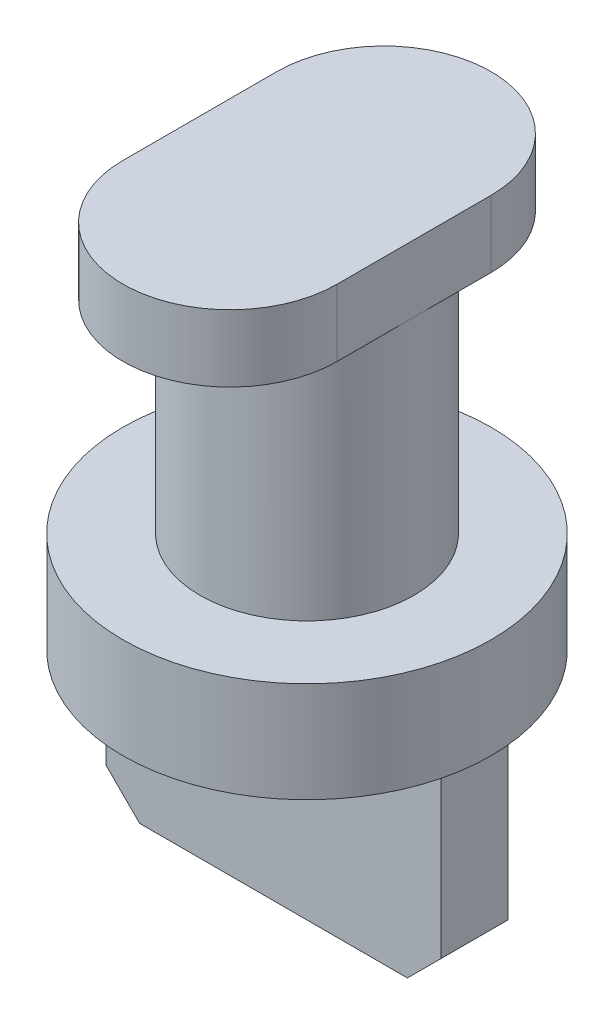
ISO-10303-21;
HEADER;
FILE_DESCRIPTION(('STEP AP214'),'2;1');
FILE_NAME('part.step','',(''),(''),'','','');
FILE_SCHEMA(('AUTOMOTIVE_DESIGN { 1 0 10303 214 1 1 1 1 }'));
ENDSEC;
DATA;
#1=APPLICATION_CONTEXT('core data for automotive mechanical design processes');
#2=APPLICATION_PROTOCOL_DEFINITION('international standard','automotive_design',2000,#1);
#3=PRODUCT_CONTEXT('',#1,'mechanical');
#4=PRODUCT('Part','Part','',(#3));
#5=PRODUCT_RELATED_PRODUCT_CATEGORY('part','',(#4));
#6=PRODUCT_DEFINITION_FORMATION('','',#4);
#7=PRODUCT_DEFINITION_CONTEXT('part definition',#1,'design');
#8=PRODUCT_DEFINITION('design','',#6,#7);
#9=PRODUCT_DEFINITION_SHAPE('','',#8);
#10=(LENGTH_UNIT() NAMED_UNIT(*) SI_UNIT(.MILLI.,.METRE.));
#11=(NAMED_UNIT(*) PLANE_ANGLE_UNIT() SI_UNIT($,.RADIAN.));
#12=(NAMED_UNIT(*) SI_UNIT($,.STERADIAN.) SOLID_ANGLE_UNIT());
#13=UNCERTAINTY_MEASURE_WITH_UNIT(LENGTH_MEASURE(1.E-05),#10,'distance_accuracy_value','');
#14=(GEOMETRIC_REPRESENTATION_CONTEXT(3) GLOBAL_UNCERTAINTY_ASSIGNED_CONTEXT((#13)) GLOBAL_UNIT_ASSIGNED_CONTEXT((#10,
#11,#12)) REPRESENTATION_CONTEXT('',''));
#15=CARTESIAN_POINT('',(0.,0.,0.));
#16=DIRECTION('',(0.,0.,1.));
#17=DIRECTION('',(1.,0.,0.));
#18=AXIS2_PLACEMENT_3D('',#15,#16,#17);
#19=CARTESIAN_POINT('',(2.5,0.5,0.5));
#20=DIRECTION('',(-1.,0.,0.));
#21=DIRECTION('',(0.,0.,1.));
#22=AXIS2_PLACEMENT_3D('',#19,#20,#21);
#23=PLANE('',#22);
#24=DIRECTION('',(0.,1.,0.));
#25=VECTOR('',#24,1.);
#26=CARTESIAN_POINT('',(2.5,0.5,-0.5));
#27=LINE('',#26,#25);
#28=CARTESIAN_POINT('',(2.5,0.5,-0.5));
#29=VERTEX_POINT('',#28);
#30=CARTESIAN_POINT('',(2.5,3.,-0.5));
#31=VERTEX_POINT('',#30);
#32=EDGE_CURVE('E141',#29,#31,#27,.T.);
#33=ORIENTED_EDGE('',*,*,#32,.T.);
#34=DIRECTION('',(0.,0.,-1.));
#35=VECTOR('',#34,1.);
#36=CARTESIAN_POINT('',(2.5,3.,0.5));
#37=LINE('',#36,#35);
#38=CARTESIAN_POINT('',(2.5,3.,0.5));
#39=VERTEX_POINT('',#38);
#40=EDGE_CURVE('E48',#39,#31,#37,.T.);
#41=ORIENTED_EDGE('',*,*,#40,.F.);
#42=DIRECTION('',(0.,1.,0.));
#43=VECTOR('',#42,1.);
#44=CARTESIAN_POINT('',(2.5,0.5,0.5));
#45=LINE('',#44,#43);
#46=CARTESIAN_POINT('',(2.5,0.5,0.5));
#47=VERTEX_POINT('',#46);
#48=EDGE_CURVE('E99',#47,#39,#45,.T.);
#49=ORIENTED_EDGE('',*,*,#48,.F.);
#50=DIRECTION('',(0.,0.,-1.));
#51=VECTOR('',#50,1.);
#52=CARTESIAN_POINT('',(2.5,0.5,0.5));
#53=LINE('',#52,#51);
#54=EDGE_CURVE('E137',#47,#29,#53,.T.);
#55=ORIENTED_EDGE('',*,*,#54,.T.);
#56=EDGE_LOOP('',(#33,#41,#49,#55));
#57=FACE_BOUND('',#56,.T.);
#58=ADVANCED_FACE('F45',(#57),#23,.F.);
#59=CARTESIAN_POINT('',(-2.5,0.5,0.5));
#60=DIRECTION('',(1.,0.,0.));
#61=DIRECTION('',(0.,0.,-1.));
#62=AXIS2_PLACEMENT_3D('',#59,#60,#61);
#63=PLANE('',#62);
#64=DIRECTION('',(0.,-1.,0.));
#65=VECTOR('',#64,1.);
#66=CARTESIAN_POINT('',(-2.5,0.5,-0.5));
#67=LINE('',#66,#65);
#68=CARTESIAN_POINT('',(-2.5,3.,-0.5));
#69=VERTEX_POINT('',#68);
#70=CARTESIAN_POINT('',(-2.5,0.5,-0.5));
#71=VERTEX_POINT('',#70);
#72=EDGE_CURVE('E150',#69,#71,#67,.T.);
#73=ORIENTED_EDGE('',*,*,#72,.T.);
#74=DIRECTION('',(0.,0.,-1.));
#75=VECTOR('',#74,1.);
#76=CARTESIAN_POINT('',(-2.5,0.5,0.5));
#77=LINE('',#76,#75);
#78=CARTESIAN_POINT('',(-2.5,0.5,0.5));
#79=VERTEX_POINT('',#78);
#80=EDGE_CURVE('E130',#79,#71,#77,.T.);
#81=ORIENTED_EDGE('',*,*,#80,.F.);
#82=DIRECTION('',(0.,-1.,0.));
#83=VECTOR('',#82,1.);
#84=CARTESIAN_POINT('',(-2.5,0.5,0.5));
#85=LINE('',#84,#83);
#86=CARTESIAN_POINT('',(-2.5,3.,0.5));
#87=VERTEX_POINT('',#86);
#88=EDGE_CURVE('E116',#87,#79,#85,.T.);
#89=ORIENTED_EDGE('',*,*,#88,.F.);
#90=DIRECTION('',(0.,0.,-1.));
#91=VECTOR('',#90,1.);
#92=CARTESIAN_POINT('',(-2.5,3.,0.5));
#93=LINE('',#92,#91);
#94=EDGE_CURVE('E165',#87,#69,#93,.T.);
#95=ORIENTED_EDGE('',*,*,#94,.T.);
#96=EDGE_LOOP('',(#73,#81,#89,#95));
#97=FACE_BOUND('',#96,.T.);
#98=ADVANCED_FACE('F182',(#97),#63,.F.);
#99=CARTESIAN_POINT('',(-2.5,0.5,0.5));
#100=DIRECTION('',(0.707106781186547,0.707106781186548,0.));
#101=DIRECTION('',(-0.707106781186548,0.707106781186547,0.));
#102=AXIS2_PLACEMENT_3D('',#99,#100,#101);
#103=PLANE('',#102);
#104=DIRECTION('',(0.707106781186548,-0.707106781186547,0.));
#105=VECTOR('',#104,1.);
#106=CARTESIAN_POINT('',(-2.5,0.5,-0.5));
#107=LINE('',#106,#105);
#108=CARTESIAN_POINT('',(-2.,0.,-0.5));
#109=VERTEX_POINT('',#108);
#110=EDGE_CURVE('E126',#71,#109,#107,.T.);
#111=ORIENTED_EDGE('',*,*,#110,.T.);
#112=DIRECTION('',(0.,0.,-1.));
#113=VECTOR('',#112,1.);
#114=CARTESIAN_POINT('',(-2.,0.,0.5));
#115=LINE('',#114,#113);
#116=CARTESIAN_POINT('',(-2.,0.,0.5));
#117=VERTEX_POINT('',#116);
#118=EDGE_CURVE('E123',#117,#109,#115,.T.);
#119=ORIENTED_EDGE('',*,*,#118,.F.);
#120=DIRECTION('',(0.707106781186548,-0.707106781186547,0.));
#121=VECTOR('',#120,1.);
#122=CARTESIAN_POINT('',(-2.5,0.5,0.5));
#123=LINE('',#122,#121);
#124=EDGE_CURVE('E109',#79,#117,#123,.T.);
#125=ORIENTED_EDGE('',*,*,#124,.F.);
#126=ORIENTED_EDGE('',*,*,#80,.T.);
#127=EDGE_LOOP('',(#111,#119,#125,#126));
#128=FACE_BOUND('',#127,.T.);
#129=ADVANCED_FACE('F124',(#128),#103,.F.);
#130=CARTESIAN_POINT('',(-2.,0.,0.5));
#131=DIRECTION('',(0.,1.,0.));
#132=DIRECTION('',(0.,0.,1.));
#133=AXIS2_PLACEMENT_3D('',#130,#131,#132);
#134=PLANE('',#133);
#135=DIRECTION('',(1.,0.,0.));
#136=VECTOR('',#135,1.);
#137=CARTESIAN_POINT('',(-2.,0.,-0.5));
#138=LINE('',#137,#136);
#139=CARTESIAN_POINT('',(2.,0.,-0.5));
#140=VERTEX_POINT('',#139);
#141=EDGE_CURVE('E155',#109,#140,#138,.T.);
#142=ORIENTED_EDGE('',*,*,#141,.T.);
#143=DIRECTION('',(0.,0.,-1.));
#144=VECTOR('',#143,1.);
#145=CARTESIAN_POINT('',(2.,0.,0.5));
#146=LINE('',#145,#144);
#147=CARTESIAN_POINT('',(2.,0.,0.5));
#148=VERTEX_POINT('',#147);
#149=EDGE_CURVE('E131',#148,#140,#146,.T.);
#150=ORIENTED_EDGE('',*,*,#149,.F.);
#151=DIRECTION('',(1.,0.,0.));
#152=VECTOR('',#151,1.);
#153=CARTESIAN_POINT('',(-2.,0.,0.5));
#154=LINE('',#153,#152);
#155=EDGE_CURVE('E113',#117,#148,#154,.T.);
#156=ORIENTED_EDGE('',*,*,#155,.F.);
#157=ORIENTED_EDGE('',*,*,#118,.T.);
#158=EDGE_LOOP('',(#142,#150,#156,#157));
#159=FACE_BOUND('',#158,.T.);
#160=ADVANCED_FACE('F133',(#159),#134,.F.);
#161=CARTESIAN_POINT('',(2.,0.,0.5));
#162=DIRECTION('',(-0.707106781186548,0.707106781186547,0.));
#163=DIRECTION('',(-0.707106781186547,-0.707106781186548,0.));
#164=AXIS2_PLACEMENT_3D('',#161,#162,#163);
#165=PLANE('',#164);
#166=DIRECTION('',(0.707106781186547,0.707106781186548,0.));
#167=VECTOR('',#166,1.);
#168=CARTESIAN_POINT('',(2.,0.,-0.5));
#169=LINE('',#168,#167);
#170=EDGE_CURVE('E93',#140,#29,#169,.T.);
#171=ORIENTED_EDGE('',*,*,#170,.T.);
#172=ORIENTED_EDGE('',*,*,#54,.F.);
#173=DIRECTION('',(0.707106781186547,0.707106781186548,0.));
#174=VECTOR('',#173,1.);
#175=CARTESIAN_POINT('',(2.,0.,0.5));
#176=LINE('',#175,#174);
#177=EDGE_CURVE('E69',#148,#47,#176,.T.);
#178=ORIENTED_EDGE('',*,*,#177,.F.);
#179=ORIENTED_EDGE('',*,*,#149,.T.);
#180=EDGE_LOOP('',(#171,#172,#178,#179));
#181=FACE_BOUND('',#180,.T.);
#182=ADVANCED_FACE('F320',(#181),#165,.F.);
#183=CARTESIAN_POINT('',(0.,0.,0.5));
#184=DIRECTION('',(0.,0.,-1.));
#185=DIRECTION('',(-1.,0.,0.));
#186=AXIS2_PLACEMENT_3D('',#183,#184,#185);
#187=PLANE('',#186);
#188=ORIENTED_EDGE('',*,*,#48,.T.);
#189=DIRECTION('',(-1.,0.,0.));
#190=VECTOR('',#189,1.);
#191=CARTESIAN_POINT('',(-2.5,3.,0.5));
#192=LINE('',#191,#190);
#193=EDGE_CURVE('E176',#39,#87,#192,.T.);
#194=ORIENTED_EDGE('',*,*,#193,.T.);
#195=ORIENTED_EDGE('',*,*,#88,.T.);
#196=ORIENTED_EDGE('',*,*,#124,.T.);
#197=ORIENTED_EDGE('',*,*,#155,.T.);
#198=ORIENTED_EDGE('',*,*,#177,.T.);
#199=EDGE_LOOP('',(#188,#194,#195,#196,#197,#198));
#200=FACE_BOUND('',#199,.T.);
#201=ADVANCED_FACE('F111',(#200),#187,.F.);
#202=CARTESIAN_POINT('',(0.,0.,-0.5));
#203=DIRECTION('',(0.,0.,-1.));
#204=DIRECTION('',(-1.,0.,0.));
#205=AXIS2_PLACEMENT_3D('',#202,#203,#204);
#206=PLANE('',#205);
#207=ORIENTED_EDGE('',*,*,#32,.F.);
#208=ORIENTED_EDGE('',*,*,#170,.F.);
#209=ORIENTED_EDGE('',*,*,#141,.F.);
#210=ORIENTED_EDGE('',*,*,#110,.F.);
#211=ORIENTED_EDGE('',*,*,#72,.F.);
#212=DIRECTION('',(-1.,0.,0.));
#213=VECTOR('',#212,1.);
#214=CARTESIAN_POINT('',(-2.5,3.,-0.5));
#215=LINE('',#214,#213);
#216=EDGE_CURVE('E145',#31,#69,#215,.T.);
#217=ORIENTED_EDGE('',*,*,#216,.F.);
#218=EDGE_LOOP('',(#207,#208,#209,#210,#211,#217));
#219=FACE_BOUND('',#218,.T.);
#220=ADVANCED_FACE('F181',(#219),#206,.T.);
#221=CARTESIAN_POINT('',(0.,3.,0.));
#222=DIRECTION('',(0.,1.,0.));
#223=DIRECTION('',(0.,0.,1.));
#224=AXIS2_PLACEMENT_3D('',#221,#222,#223);
#225=PLANE('',#224);
#226=CARTESIAN_POINT('',(0.,3.,0.));
#227=DIRECTION('',(0.,1.,0.));
#228=DIRECTION('',(0.,0.,1.));
#229=AXIS2_PLACEMENT_3D('',#226,#227,#228);
#230=CIRCLE('',#229,2.75);
#231=CARTESIAN_POINT('',(0.,3.,2.75));
#232=VERTEX_POINT('',#231);
#233=EDGE_CURVE('E189',#232,#232,#230,.T.);
#234=ORIENTED_EDGE('',*,*,#233,.F.);
#235=EDGE_LOOP('',(#234));
#236=FACE_BOUND('',#235,.T.);
#237=ORIENTED_EDGE('',*,*,#40,.T.);
#238=ORIENTED_EDGE('',*,*,#216,.T.);
#239=ORIENTED_EDGE('',*,*,#94,.F.);
#240=ORIENTED_EDGE('',*,*,#193,.F.);
#241=EDGE_LOOP('',(#237,#238,#239,#240));
#242=FACE_BOUND('',#241,.T.);
#243=ADVANCED_FACE('F174',(#236,#242),#225,.F.);
#244=CARTESIAN_POINT('',(0.,4.5,0.));
#245=DIRECTION('',(0.,-1.,0.));
#246=DIRECTION('',(0.,0.,-1.));
#247=AXIS2_PLACEMENT_3D('',#244,#245,#246);
#248=CYLINDRICAL_SURFACE('',#247,2.75);
#249=CARTESIAN_POINT('',(0.,4.5,0.));
#250=DIRECTION('',(0.,1.,0.));
#251=DIRECTION('',(0.,0.,1.));
#252=AXIS2_PLACEMENT_3D('',#249,#250,#251);
#253=CIRCLE('',#252,2.75);
#254=CARTESIAN_POINT('',(0.,4.5,2.75));
#255=VERTEX_POINT('',#254);
#256=EDGE_CURVE('E146',#255,#255,#253,.T.);
#257=ORIENTED_EDGE('',*,*,#256,.F.);
#258=EDGE_LOOP('',(#257));
#259=FACE_BOUND('',#258,.T.);
#260=ORIENTED_EDGE('',*,*,#233,.T.);
#261=EDGE_LOOP('',(#260));
#262=FACE_BOUND('',#261,.T.);
#263=ADVANCED_FACE('F325',(#259,#262),#248,.T.);
#264=CARTESIAN_POINT('',(0.,4.5,0.));
#265=DIRECTION('',(0.,1.,0.));
#266=DIRECTION('',(0.,0.,1.));
#267=AXIS2_PLACEMENT_3D('',#264,#265,#266);
#268=PLANE('',#267);
#269=CARTESIAN_POINT('',(0.,4.5,0.));
#270=DIRECTION('',(0.,1.,0.));
#271=DIRECTION('',(0.,0.,1.));
#272=AXIS2_PLACEMENT_3D('',#269,#270,#271);
#273=CIRCLE('',#272,1.6);
#274=CARTESIAN_POINT('',(0.,4.5,1.6));
#275=VERTEX_POINT('',#274);
#276=EDGE_CURVE('E11',#275,#275,#273,.T.);
#277=ORIENTED_EDGE('',*,*,#276,.F.);
#278=EDGE_LOOP('',(#277));
#279=FACE_BOUND('',#278,.T.);
#280=ORIENTED_EDGE('',*,*,#256,.T.);
#281=EDGE_LOOP('',(#280));
#282=FACE_BOUND('',#281,.T.);
#283=ADVANCED_FACE('F303',(#279,#282),#268,.T.);
#284=CARTESIAN_POINT('',(0.,8.1,0.));
#285=DIRECTION('',(0.,-1.,0.));
#286=DIRECTION('',(0.,0.,-1.));
#287=AXIS2_PLACEMENT_3D('',#284,#285,#286);
#288=CYLINDRICAL_SURFACE('',#287,1.6);
#289=CARTESIAN_POINT('',(0.,8.1,0.));
#290=DIRECTION('',(0.,1.,0.));
#291=DIRECTION('',(0.,0.,1.));
#292=AXIS2_PLACEMENT_3D('',#289,#290,#291);
#293=CIRCLE('',#292,1.6);
#294=CARTESIAN_POINT('',(1.6,8.1,0.));
#295=VERTEX_POINT('',#294);
#296=CARTESIAN_POINT('',(-1.6,8.1,0.));
#297=VERTEX_POINT('',#296);
#298=EDGE_CURVE('E193',#295,#297,#293,.T.);
#299=ORIENTED_EDGE('',*,*,#298,.F.);
#300=EDGE_CURVE('E60',#297,#295,#293,.T.);
#301=ORIENTED_EDGE('',*,*,#300,.F.);
#302=EDGE_LOOP('',(#299,#301));
#303=FACE_BOUND('',#302,.T.);
#304=ORIENTED_EDGE('',*,*,#276,.T.);
#305=EDGE_LOOP('',(#304));
#306=FACE_BOUND('',#305,.T.);
#307=ADVANCED_FACE('F297',(#303,#306),#288,.T.);
#308=CARTESIAN_POINT('',(0.,8.1,1.15));
#309=DIRECTION('',(0.,1.,0.));
#310=DIRECTION('',(0.,0.,1.));
#311=AXIS2_PLACEMENT_3D('',#308,#309,#310);
#312=PLANE('',#311);
#313=DIRECTION('',(0.,0.,-1.));
#314=VECTOR('',#313,1.);
#315=CARTESIAN_POINT('',(1.6,8.1,1.15));
#316=LINE('',#315,#314);
#317=CARTESIAN_POINT('',(1.6,8.1,-1.15));
#318=VERTEX_POINT('',#317);
#319=EDGE_CURVE('E230',#295,#318,#316,.T.);
#320=ORIENTED_EDGE('',*,*,#319,.F.);
#321=ORIENTED_EDGE('',*,*,#298,.T.);
#322=DIRECTION('',(0.,0.,1.));
#323=VECTOR('',#322,1.);
#324=CARTESIAN_POINT('',(-1.6,8.1,1.15));
#325=LINE('',#324,#323);
#326=CARTESIAN_POINT('',(-1.6,8.1,-1.15));
#327=VERTEX_POINT('',#326);
#328=EDGE_CURVE('E216',#327,#297,#325,.T.);
#329=ORIENTED_EDGE('',*,*,#328,.F.);
#330=CARTESIAN_POINT('',(0.,8.1,-1.15));
#331=DIRECTION('',(0.,1.,0.));
#332=DIRECTION('',(0.,0.,1.));
#333=AXIS2_PLACEMENT_3D('',#330,#331,#332);
#334=CIRCLE('',#333,1.6);
#335=EDGE_CURVE('E222',#318,#327,#334,.T.);
#336=ORIENTED_EDGE('',*,*,#335,.F.);
#337=EDGE_LOOP('',(#320,#321,#329,#336));
#338=FACE_BOUND('',#337,.T.);
#339=ADVANCED_FACE('F294',(#338),#312,.F.);
#340=CARTESIAN_POINT('',(-1.6,8.1,1.15));
#341=VERTEX_POINT('',#340);
#342=EDGE_CURVE('E221',#297,#341,#325,.T.);
#343=ORIENTED_EDGE('',*,*,#342,.F.);
#344=ORIENTED_EDGE('',*,*,#300,.T.);
#345=CARTESIAN_POINT('',(1.6,8.1,1.15));
#346=VERTEX_POINT('',#345);
#347=EDGE_CURVE('E226',#346,#295,#316,.T.);
#348=ORIENTED_EDGE('',*,*,#347,.F.);
#349=CARTESIAN_POINT('',(0.,8.1,1.15));
#350=DIRECTION('',(0.,1.,0.));
#351=DIRECTION('',(0.,0.,1.));
#352=AXIS2_PLACEMENT_3D('',#349,#350,#351);
#353=CIRCLE('',#352,1.6);
#354=EDGE_CURVE('E231',#341,#346,#353,.T.);
#355=ORIENTED_EDGE('',*,*,#354,.F.);
#356=EDGE_LOOP('',(#343,#344,#348,#355));
#357=FACE_BOUND('',#356,.T.);
#358=ADVANCED_FACE('F290',(#357),#312,.F.);
#359=CARTESIAN_POINT('',(0.,9.1,1.15));
#360=DIRECTION('',(0.,-1.,0.));
#361=DIRECTION('',(0.,0.,-1.));
#362=AXIS2_PLACEMENT_3D('',#359,#360,#361);
#363=CYLINDRICAL_SURFACE('',#362,1.6);
#364=ORIENTED_EDGE('',*,*,#354,.T.);
#365=DIRECTION('',(0.,-1.,0.));
#366=VECTOR('',#365,1.);
#367=CARTESIAN_POINT('',(1.6,9.1,1.15));
#368=LINE('',#367,#366);
#369=CARTESIAN_POINT('',(1.6,9.1,1.15));
#370=VERTEX_POINT('',#369);
#371=EDGE_CURVE('E199',#370,#346,#368,.T.);
#372=ORIENTED_EDGE('',*,*,#371,.F.);
#373=CARTESIAN_POINT('',(0.,9.1,1.15));
#374=DIRECTION('',(0.,1.,0.));
#375=DIRECTION('',(0.,0.,1.));
#376=AXIS2_PLACEMENT_3D('',#373,#374,#375);
#377=CIRCLE('',#376,1.6);
#378=CARTESIAN_POINT('',(-1.6,9.1,1.15));
#379=VERTEX_POINT('',#378);
#380=EDGE_CURVE('E220',#379,#370,#377,.T.);
#381=ORIENTED_EDGE('',*,*,#380,.F.);
#382=DIRECTION('',(0.,-1.,0.));
#383=VECTOR('',#382,1.);
#384=CARTESIAN_POINT('',(-1.6,9.1,1.15));
#385=LINE('',#384,#383);
#386=EDGE_CURVE('E211',#379,#341,#385,.T.);
#387=ORIENTED_EDGE('',*,*,#386,.T.);
#388=EDGE_LOOP('',(#364,#372,#381,#387));
#389=FACE_BOUND('',#388,.T.);
#390=ADVANCED_FACE('F262',(#389),#363,.T.);
#391=CARTESIAN_POINT('',(1.6,9.1,1.15));
#392=DIRECTION('',(-1.,0.,0.));
#393=DIRECTION('',(0.,0.,1.));
#394=AXIS2_PLACEMENT_3D('',#391,#392,#393);
#395=PLANE('',#394);
#396=ORIENTED_EDGE('',*,*,#347,.T.);
#397=ORIENTED_EDGE('',*,*,#319,.T.);
#398=DIRECTION('',(0.,-1.,0.));
#399=VECTOR('',#398,1.);
#400=CARTESIAN_POINT('',(1.6,9.1,-1.15));
#401=LINE('',#400,#399);
#402=CARTESIAN_POINT('',(1.6,9.1,-1.15));
#403=VERTEX_POINT('',#402);
#404=EDGE_CURVE('E203',#403,#318,#401,.T.);
#405=ORIENTED_EDGE('',*,*,#404,.F.);
#406=DIRECTION('',(0.,0.,-1.));
#407=VECTOR('',#406,1.);
#408=CARTESIAN_POINT('',(1.6,9.1,1.15));
#409=LINE('',#408,#407);
#410=EDGE_CURVE('E242',#370,#403,#409,.T.);
#411=ORIENTED_EDGE('',*,*,#410,.F.);
#412=ORIENTED_EDGE('',*,*,#371,.T.);
#413=EDGE_LOOP('',(#396,#397,#405,#411,#412));
#414=FACE_BOUND('',#413,.T.);
#415=ADVANCED_FACE('F266',(#414),#395,.F.);
#416=CARTESIAN_POINT('',(0.,9.1,-1.15));
#417=DIRECTION('',(0.,-1.,0.));
#418=DIRECTION('',(0.,0.,-1.));
#419=AXIS2_PLACEMENT_3D('',#416,#417,#418);
#420=CYLINDRICAL_SURFACE('',#419,1.6);
#421=ORIENTED_EDGE('',*,*,#335,.T.);
#422=DIRECTION('',(0.,-1.,0.));
#423=VECTOR('',#422,1.);
#424=CARTESIAN_POINT('',(-1.6,9.1,-1.15));
#425=LINE('',#424,#423);
#426=CARTESIAN_POINT('',(-1.6,9.1,-1.15));
#427=VERTEX_POINT('',#426);
#428=EDGE_CURVE('E207',#427,#327,#425,.T.);
#429=ORIENTED_EDGE('',*,*,#428,.F.);
#430=CARTESIAN_POINT('',(0.,9.1,-1.15));
#431=DIRECTION('',(0.,1.,0.));
#432=DIRECTION('',(0.,0.,1.));
#433=AXIS2_PLACEMENT_3D('',#430,#431,#432);
#434=CIRCLE('',#433,1.6);
#435=EDGE_CURVE('E238',#403,#427,#434,.T.);
#436=ORIENTED_EDGE('',*,*,#435,.F.);
#437=ORIENTED_EDGE('',*,*,#404,.T.);
#438=EDGE_LOOP('',(#421,#429,#436,#437));
#439=FACE_BOUND('',#438,.T.);
#440=ADVANCED_FACE('F284',(#439),#420,.T.);
#441=CARTESIAN_POINT('',(-1.6,9.1,1.15));
#442=DIRECTION('',(1.,0.,0.));
#443=DIRECTION('',(0.,0.,-1.));
#444=AXIS2_PLACEMENT_3D('',#441,#442,#443);
#445=PLANE('',#444);
#446=ORIENTED_EDGE('',*,*,#328,.T.);
#447=ORIENTED_EDGE('',*,*,#342,.T.);
#448=ORIENTED_EDGE('',*,*,#386,.F.);
#449=DIRECTION('',(0.,0.,1.));
#450=VECTOR('',#449,1.);
#451=CARTESIAN_POINT('',(-1.6,9.1,1.15));
#452=LINE('',#451,#450);
#453=EDGE_CURVE('E215',#427,#379,#452,.T.);
#454=ORIENTED_EDGE('',*,*,#453,.F.);
#455=ORIENTED_EDGE('',*,*,#428,.T.);
#456=EDGE_LOOP('',(#446,#447,#448,#454,#455));
#457=FACE_BOUND('',#456,.T.);
#458=ADVANCED_FACE('F288',(#457),#445,.F.);
#459=CARTESIAN_POINT('',(0.,9.1,1.15));
#460=DIRECTION('',(0.,1.,0.));
#461=DIRECTION('',(0.,0.,1.));
#462=AXIS2_PLACEMENT_3D('',#459,#460,#461);
#463=PLANE('',#462);
#464=ORIENTED_EDGE('',*,*,#380,.T.);
#465=ORIENTED_EDGE('',*,*,#410,.T.);
#466=ORIENTED_EDGE('',*,*,#435,.T.);
#467=ORIENTED_EDGE('',*,*,#453,.T.);
#468=EDGE_LOOP('',(#464,#465,#466,#467));
#469=FACE_BOUND('',#468,.T.);
#470=ADVANCED_FACE('F252',(#469),#463,.T.);
#471=CLOSED_SHELL('',(#58,#98,#129,#160,#182,#201,#220,#243,#263,#283,#307,#339,#358,#390,#415,
#440,#458,#470));
#472=MANIFOLD_SOLID_BREP('B2',#471);
#473=ADVANCED_BREP_SHAPE_REPRESENTATION('',(#18,#472),#14);
#474=SHAPE_DEFINITION_REPRESENTATION(#9,#473);
ENDSEC;
END-ISO-10303-21;
